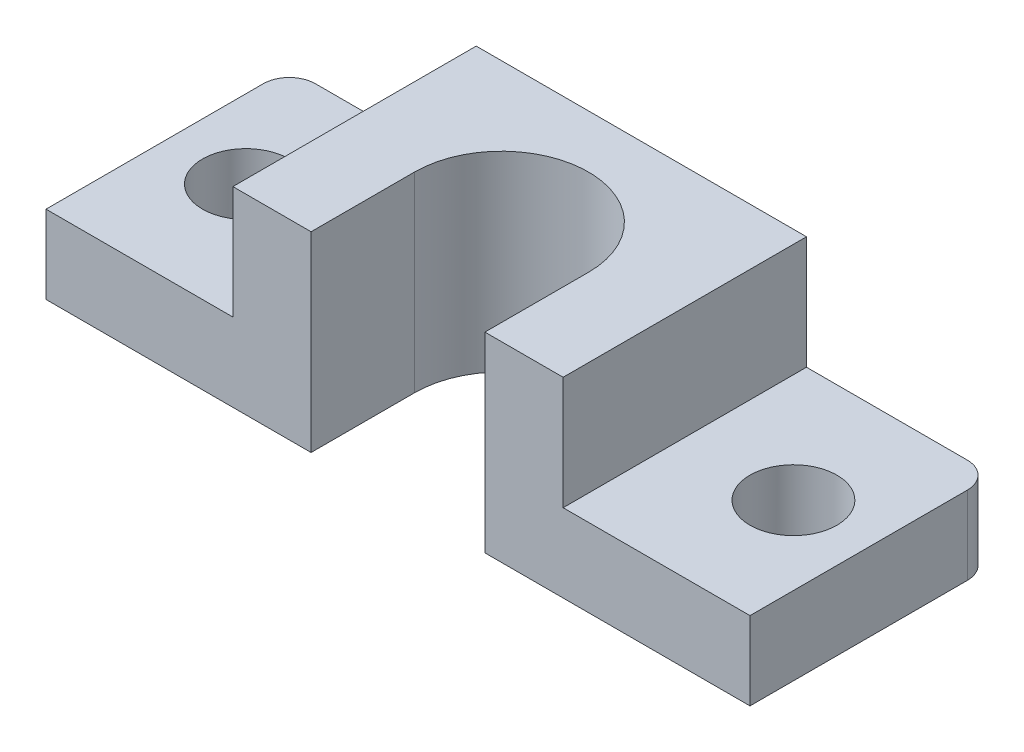
ISO-10303-21;
HEADER;
FILE_DESCRIPTION(('STEP AP214'),'2;1');
FILE_NAME('part.step','',(''),(''),'','','');
FILE_SCHEMA(('AUTOMOTIVE_DESIGN { 1 0 10303 214 1 1 1 1 }'));
ENDSEC;
DATA;
#1=APPLICATION_CONTEXT('core data for automotive mechanical design processes');
#2=APPLICATION_PROTOCOL_DEFINITION('international standard','automotive_design',2000,#1);
#3=PRODUCT_CONTEXT('',#1,'mechanical');
#4=PRODUCT('Part','Part','',(#3));
#5=PRODUCT_RELATED_PRODUCT_CATEGORY('part','',(#4));
#6=PRODUCT_DEFINITION_FORMATION('','',#4);
#7=PRODUCT_DEFINITION_CONTEXT('part definition',#1,'design');
#8=PRODUCT_DEFINITION('design','',#6,#7);
#9=PRODUCT_DEFINITION_SHAPE('','',#8);
#10=(LENGTH_UNIT() NAMED_UNIT(*) SI_UNIT(.MILLI.,.METRE.));
#11=(NAMED_UNIT(*) PLANE_ANGLE_UNIT() SI_UNIT($,.RADIAN.));
#12=(NAMED_UNIT(*) SI_UNIT($,.STERADIAN.) SOLID_ANGLE_UNIT());
#13=UNCERTAINTY_MEASURE_WITH_UNIT(LENGTH_MEASURE(1.E-05),#10,'distance_accuracy_value','');
#14=(GEOMETRIC_REPRESENTATION_CONTEXT(3) GLOBAL_UNCERTAINTY_ASSIGNED_CONTEXT((#13)) GLOBAL_UNIT_ASSIGNED_CONTEXT((#10,
#11,#12)) REPRESENTATION_CONTEXT('',''));
#15=CARTESIAN_POINT('',(0.,0.,0.));
#16=DIRECTION('',(0.,0.,1.));
#17=DIRECTION('',(1.,0.,0.));
#18=AXIS2_PLACEMENT_3D('',#15,#16,#17);
#19=CARTESIAN_POINT('',(0.,9.,0.));
#20=DIRECTION('',(0.,0.,-1.));
#21=DIRECTION('',(-1.,0.,0.));
#22=AXIS2_PLACEMENT_3D('',#19,#20,#21);
#23=PLANE('',#22);
#24=DIRECTION('',(1.,0.,0.));
#25=VECTOR('',#24,1.);
#26=CARTESIAN_POINT('',(0.,0.,0.));
#27=LINE('',#26,#25);
#28=CARTESIAN_POINT('',(0.,0.,0.));
#29=VERTEX_POINT('',#28);
#30=CARTESIAN_POINT('',(30.5,0.,0.));
#31=VERTEX_POINT('',#30);
#32=EDGE_CURVE('E217',#29,#31,#27,.T.);
#33=ORIENTED_EDGE('',*,*,#32,.T.);
#34=DIRECTION('',(0.,1.,0.));
#35=VECTOR('',#34,1.);
#36=CARTESIAN_POINT('',(30.5,-11.,0.));
#37=LINE('',#36,#35);
#38=CARTESIAN_POINT('',(30.5,22.,0.));
#39=VERTEX_POINT('',#38);
#40=EDGE_CURVE('E164',#31,#39,#37,.T.);
#41=ORIENTED_EDGE('',*,*,#40,.T.);
#42=DIRECTION('',(1.,0.,0.));
#43=VECTOR('',#42,1.);
#44=CARTESIAN_POINT('',(21.5,22.,0.));
#45=LINE('',#44,#43);
#46=CARTESIAN_POINT('',(21.5,22.,0.));
#47=VERTEX_POINT('',#46);
#48=EDGE_CURVE('E180',#47,#39,#45,.T.);
#49=ORIENTED_EDGE('',*,*,#48,.F.);
#50=DIRECTION('',(0.,-1.,0.));
#51=VECTOR('',#50,1.);
#52=CARTESIAN_POINT('',(21.5,22.,0.));
#53=LINE('',#52,#51);
#54=CARTESIAN_POINT('',(21.5,9.,0.));
#55=VERTEX_POINT('',#54);
#56=EDGE_CURVE('E199',#47,#55,#53,.T.);
#57=ORIENTED_EDGE('',*,*,#56,.T.);
#58=DIRECTION('',(1.,0.,0.));
#59=VECTOR('',#58,1.);
#60=CARTESIAN_POINT('',(0.,9.,0.));
#61=LINE('',#60,#59);
#62=CARTESIAN_POINT('',(0.,9.,0.));
#63=VERTEX_POINT('',#62);
#64=EDGE_CURVE('E207',#63,#55,#61,.T.);
#65=ORIENTED_EDGE('',*,*,#64,.F.);
#66=DIRECTION('',(0.,-1.,0.));
#67=VECTOR('',#66,1.);
#68=CARTESIAN_POINT('',(0.,9.,0.));
#69=LINE('',#68,#67);
#70=EDGE_CURVE('E226',#63,#29,#69,.T.);
#71=ORIENTED_EDGE('',*,*,#70,.T.);
#72=EDGE_LOOP('',(#33,#41,#49,#57,#65,#71));
#73=FACE_BOUND('',#72,.T.);
#74=ADVANCED_FACE('F33',(#73),#23,.F.);
#75=CARTESIAN_POINT('',(0.,9.,0.));
#76=DIRECTION('',(0.,-1.,0.));
#77=DIRECTION('',(0.,0.,-1.));
#78=AXIS2_PLACEMENT_3D('',#75,#76,#77);
#79=PLANE('',#78);
#80=CARTESIAN_POINT('',(9.,9.,-14.));
#81=DIRECTION('',(0.,1.,0.));
#82=DIRECTION('',(0.,0.,1.));
#83=AXIS2_PLACEMENT_3D('',#80,#81,#82);
#84=CIRCLE('',#83,5.);
#85=CARTESIAN_POINT('',(9.,9.,-9.));
#86=VERTEX_POINT('',#85);
#87=EDGE_CURVE('E232',#86,#86,#84,.T.);
#88=ORIENTED_EDGE('',*,*,#87,.F.);
#89=EDGE_LOOP('',(#88));
#90=FACE_BOUND('',#89,.T.);
#91=DIRECTION('',(-1.,0.,0.));
#92=VECTOR('',#91,1.);
#93=CARTESIAN_POINT('',(0.,9.,-28.));
#94=LINE('',#93,#92);
#95=CARTESIAN_POINT('',(21.5,9.,-28.));
#96=VERTEX_POINT('',#95);
#97=CARTESIAN_POINT('',(3.,9.,-28.));
#98=VERTEX_POINT('',#97);
#99=EDGE_CURVE('E211',#96,#98,#94,.T.);
#100=ORIENTED_EDGE('',*,*,#99,.T.);
#101=CARTESIAN_POINT('',(3.,9.,-25.));
#102=DIRECTION('',(0.,-1.,0.));
#103=DIRECTION('',(0.,0.,-1.));
#104=AXIS2_PLACEMENT_3D('',#101,#102,#103);
#105=CIRCLE('',#104,3.);
#106=CARTESIAN_POINT('',(0.,9.,-25.));
#107=VERTEX_POINT('',#106);
#108=EDGE_CURVE('E11',#98,#107,#105,.F.);
#109=ORIENTED_EDGE('',*,*,#108,.T.);
#110=DIRECTION('',(0.,0.,1.));
#111=VECTOR('',#110,1.);
#112=CARTESIAN_POINT('',(0.,9.,0.));
#113=LINE('',#112,#111);
#114=EDGE_CURVE('E203',#107,#63,#113,.T.);
#115=ORIENTED_EDGE('',*,*,#114,.T.);
#116=ORIENTED_EDGE('',*,*,#64,.T.);
#117=DIRECTION('',(0.,0.,1.));
#118=VECTOR('',#117,1.);
#119=CARTESIAN_POINT('',(21.5,9.,-28.));
#120=LINE('',#119,#118);
#121=EDGE_CURVE('E174',#96,#55,#120,.T.);
#122=ORIENTED_EDGE('',*,*,#121,.F.);
#123=EDGE_LOOP('',(#100,#109,#115,#116,#122));
#124=FACE_BOUND('',#123,.T.);
#125=ADVANCED_FACE('F262',(#90,#124),#79,.F.);
#126=CARTESIAN_POINT('',(72.,9.,-14.));
#127=DIRECTION('',(0.,1.,0.));
#128=DIRECTION('',(0.,0.,1.));
#129=AXIS2_PLACEMENT_3D('',#126,#127,#128);
#130=CIRCLE('',#129,5.);
#131=CARTESIAN_POINT('',(72.,9.,-9.));
#132=VERTEX_POINT('',#131);
#133=EDGE_CURVE('E236',#132,#132,#130,.T.);
#134=ORIENTED_EDGE('',*,*,#133,.F.);
#135=EDGE_LOOP('',(#134));
#136=FACE_BOUND('',#135,.T.);
#137=DIRECTION('',(0.,0.,-1.));
#138=VECTOR('',#137,1.);
#139=CARTESIAN_POINT('',(81.,9.,0.));
#140=LINE('',#139,#138);
#141=CARTESIAN_POINT('',(81.,9.,0.));
#142=VERTEX_POINT('',#141);
#143=CARTESIAN_POINT('',(81.,9.,-25.));
#144=VERTEX_POINT('',#143);
#145=EDGE_CURVE('E209',#142,#144,#140,.T.);
#146=ORIENTED_EDGE('',*,*,#145,.T.);
#147=CARTESIAN_POINT('',(78.,9.,-25.));
#148=DIRECTION('',(0.,-1.,0.));
#149=DIRECTION('',(0.,0.,-1.));
#150=AXIS2_PLACEMENT_3D('',#147,#148,#149);
#151=CIRCLE('',#150,3.);
#152=CARTESIAN_POINT('',(78.,9.,-28.));
#153=VERTEX_POINT('',#152);
#154=EDGE_CURVE('E246',#144,#153,#151,.F.);
#155=ORIENTED_EDGE('',*,*,#154,.T.);
#156=CARTESIAN_POINT('',(59.5,9.,-28.));
#157=VERTEX_POINT('',#156);
#158=EDGE_CURVE('E212',#153,#157,#94,.T.);
#159=ORIENTED_EDGE('',*,*,#158,.T.);
#160=DIRECTION('',(0.,0.,-1.));
#161=VECTOR('',#160,1.);
#162=CARTESIAN_POINT('',(59.5,9.,-28.));
#163=LINE('',#162,#161);
#164=CARTESIAN_POINT('',(59.5,9.,0.));
#165=VERTEX_POINT('',#164);
#166=EDGE_CURVE('E179',#165,#157,#163,.T.);
#167=ORIENTED_EDGE('',*,*,#166,.F.);
#168=EDGE_CURVE('E205',#165,#142,#61,.T.);
#169=ORIENTED_EDGE('',*,*,#168,.T.);
#170=EDGE_LOOP('',(#146,#155,#159,#167,#169));
#171=FACE_BOUND('',#170,.T.);
#172=ADVANCED_FACE('F281',(#136,#171),#79,.F.);
#173=CARTESIAN_POINT('',(0.,9.,0.));
#174=DIRECTION('',(1.,0.,0.));
#175=DIRECTION('',(0.,0.,-1.));
#176=AXIS2_PLACEMENT_3D('',#173,#174,#175);
#177=PLANE('',#176);
#178=ORIENTED_EDGE('',*,*,#114,.F.);
#179=DIRECTION('',(0.,-1.,0.));
#180=VECTOR('',#179,1.);
#181=CARTESIAN_POINT('',(0.,9.,-25.));
#182=LINE('',#181,#180);
#183=CARTESIAN_POINT('',(0.,0.,-25.));
#184=VERTEX_POINT('',#183);
#185=EDGE_CURVE('E41',#107,#184,#182,.T.);
#186=ORIENTED_EDGE('',*,*,#185,.T.);
#187=DIRECTION('',(0.,0.,1.));
#188=VECTOR('',#187,1.);
#189=CARTESIAN_POINT('',(0.,0.,0.));
#190=LINE('',#189,#188);
#191=EDGE_CURVE('E202',#184,#29,#190,.T.);
#192=ORIENTED_EDGE('',*,*,#191,.T.);
#193=ORIENTED_EDGE('',*,*,#70,.F.);
#194=EDGE_LOOP('',(#178,#186,#192,#193));
#195=FACE_BOUND('',#194,.T.);
#196=ADVANCED_FACE('F251',(#195),#177,.F.);
#197=CARTESIAN_POINT('',(50.5,22.,0.));
#198=VERTEX_POINT('',#197);
#199=CARTESIAN_POINT('',(59.5,22.,0.));
#200=VERTEX_POINT('',#199);
#201=EDGE_CURVE('E178',#198,#200,#45,.T.);
#202=ORIENTED_EDGE('',*,*,#201,.F.);
#203=DIRECTION('',(0.,1.,0.));
#204=VECTOR('',#203,1.);
#205=CARTESIAN_POINT('',(50.5,-11.,0.));
#206=LINE('',#205,#204);
#207=CARTESIAN_POINT('',(50.5,0.,0.));
#208=VERTEX_POINT('',#207);
#209=EDGE_CURVE('E147',#208,#198,#206,.T.);
#210=ORIENTED_EDGE('',*,*,#209,.F.);
#211=CARTESIAN_POINT('',(81.,0.,0.));
#212=VERTEX_POINT('',#211);
#213=EDGE_CURVE('E216',#208,#212,#27,.T.);
#214=ORIENTED_EDGE('',*,*,#213,.T.);
#215=DIRECTION('',(0.,-1.,0.));
#216=VECTOR('',#215,1.);
#217=CARTESIAN_POINT('',(81.,9.,0.));
#218=LINE('',#217,#216);
#219=EDGE_CURVE('E214',#142,#212,#218,.T.);
#220=ORIENTED_EDGE('',*,*,#219,.F.);
#221=ORIENTED_EDGE('',*,*,#168,.F.);
#222=DIRECTION('',(0.,-1.,0.));
#223=VECTOR('',#222,1.);
#224=CARTESIAN_POINT('',(59.5,22.,0.));
#225=LINE('',#224,#223);
#226=EDGE_CURVE('E196',#200,#165,#225,.T.);
#227=ORIENTED_EDGE('',*,*,#226,.F.);
#228=EDGE_LOOP('',(#202,#210,#214,#220,#221,#227));
#229=FACE_BOUND('',#228,.T.);
#230=ADVANCED_FACE('F284',(#229),#23,.F.);
#231=CARTESIAN_POINT('',(81.,9.,0.));
#232=DIRECTION('',(-1.,0.,0.));
#233=DIRECTION('',(0.,0.,1.));
#234=AXIS2_PLACEMENT_3D('',#231,#232,#233);
#235=PLANE('',#234);
#236=DIRECTION('',(0.,0.,-1.));
#237=VECTOR('',#236,1.);
#238=CARTESIAN_POINT('',(81.,0.,0.));
#239=LINE('',#238,#237);
#240=CARTESIAN_POINT('',(81.,0.,-25.));
#241=VERTEX_POINT('',#240);
#242=EDGE_CURVE('E220',#212,#241,#239,.T.);
#243=ORIENTED_EDGE('',*,*,#242,.T.);
#244=DIRECTION('',(0.,-1.,0.));
#245=VECTOR('',#244,1.);
#246=CARTESIAN_POINT('',(81.,9.,-25.));
#247=LINE('',#246,#245);
#248=EDGE_CURVE('E54',#241,#144,#247,.F.);
#249=ORIENTED_EDGE('',*,*,#248,.T.);
#250=ORIENTED_EDGE('',*,*,#145,.F.);
#251=ORIENTED_EDGE('',*,*,#219,.T.);
#252=EDGE_LOOP('',(#243,#249,#250,#251));
#253=FACE_BOUND('',#252,.T.);
#254=ADVANCED_FACE('F287',(#253),#235,.F.);
#255=CARTESIAN_POINT('',(0.,9.,-28.));
#256=DIRECTION('',(0.,0.,1.));
#257=DIRECTION('',(1.,0.,0.));
#258=AXIS2_PLACEMENT_3D('',#255,#256,#257);
#259=PLANE('',#258);
#260=ORIENTED_EDGE('',*,*,#158,.F.);
#261=DIRECTION('',(0.,-1.,0.));
#262=VECTOR('',#261,1.);
#263=CARTESIAN_POINT('',(78.,9.,-28.));
#264=LINE('',#263,#262);
#265=CARTESIAN_POINT('',(78.,0.,-28.));
#266=VERTEX_POINT('',#265);
#267=EDGE_CURVE('E238',#153,#266,#264,.T.);
#268=ORIENTED_EDGE('',*,*,#267,.T.);
#269=DIRECTION('',(-1.,0.,0.));
#270=VECTOR('',#269,1.);
#271=CARTESIAN_POINT('',(0.,0.,-28.));
#272=LINE('',#271,#270);
#273=CARTESIAN_POINT('',(3.,0.,-28.));
#274=VERTEX_POINT('',#273);
#275=EDGE_CURVE('E206',#266,#274,#272,.T.);
#276=ORIENTED_EDGE('',*,*,#275,.T.);
#277=DIRECTION('',(0.,-1.,0.));
#278=VECTOR('',#277,1.);
#279=CARTESIAN_POINT('',(3.,9.,-28.));
#280=LINE('',#279,#278);
#281=EDGE_CURVE('E229',#274,#98,#280,.F.);
#282=ORIENTED_EDGE('',*,*,#281,.T.);
#283=ORIENTED_EDGE('',*,*,#99,.F.);
#284=DIRECTION('',(0.,-1.,0.));
#285=VECTOR('',#284,1.);
#286=CARTESIAN_POINT('',(21.5,22.,-28.));
#287=LINE('',#286,#285);
#288=CARTESIAN_POINT('',(21.5,22.,-28.));
#289=VERTEX_POINT('',#288);
#290=EDGE_CURVE('E186',#289,#96,#287,.T.);
#291=ORIENTED_EDGE('',*,*,#290,.F.);
#292=DIRECTION('',(-1.,0.,0.));
#293=VECTOR('',#292,1.);
#294=CARTESIAN_POINT('',(21.5,22.,-28.));
#295=LINE('',#294,#293);
#296=CARTESIAN_POINT('',(59.5,22.,-28.));
#297=VERTEX_POINT('',#296);
#298=EDGE_CURVE('E184',#297,#289,#295,.T.);
#299=ORIENTED_EDGE('',*,*,#298,.F.);
#300=DIRECTION('',(0.,-1.,0.));
#301=VECTOR('',#300,1.);
#302=CARTESIAN_POINT('',(59.5,22.,-28.));
#303=LINE('',#302,#301);
#304=EDGE_CURVE('E193',#297,#157,#303,.T.);
#305=ORIENTED_EDGE('',*,*,#304,.T.);
#306=EDGE_LOOP('',(#260,#268,#276,#282,#283,#291,#299,#305));
#307=FACE_BOUND('',#306,.T.);
#308=ADVANCED_FACE('F268',(#307),#259,.F.);
#309=CARTESIAN_POINT('',(0.,0.,0.));
#310=DIRECTION('',(0.,-1.,0.));
#311=DIRECTION('',(0.,0.,-1.));
#312=AXIS2_PLACEMENT_3D('',#309,#310,#311);
#313=PLANE('',#312);
#314=CARTESIAN_POINT('',(72.,0.,-14.));
#315=DIRECTION('',(0.,-1.,0.));
#316=DIRECTION('',(0.,0.,-1.));
#317=AXIS2_PLACEMENT_3D('',#314,#315,#316);
#318=CIRCLE('',#317,5.);
#319=CARTESIAN_POINT('',(72.,0.,-19.));
#320=VERTEX_POINT('',#319);
#321=EDGE_CURVE('E233',#320,#320,#318,.T.);
#322=ORIENTED_EDGE('',*,*,#321,.F.);
#323=EDGE_LOOP('',(#322));
#324=FACE_BOUND('',#323,.T.);
#325=CARTESIAN_POINT('',(9.,0.,-14.));
#326=DIRECTION('',(0.,-1.,0.));
#327=DIRECTION('',(0.,0.,-1.));
#328=AXIS2_PLACEMENT_3D('',#325,#326,#327);
#329=CIRCLE('',#328,5.);
#330=CARTESIAN_POINT('',(9.,0.,-19.));
#331=VERTEX_POINT('',#330);
#332=EDGE_CURVE('E155',#331,#331,#329,.T.);
#333=ORIENTED_EDGE('',*,*,#332,.F.);
#334=EDGE_LOOP('',(#333));
#335=FACE_BOUND('',#334,.T.);
#336=ORIENTED_EDGE('',*,*,#275,.F.);
#337=CARTESIAN_POINT('',(78.,0.,-25.));
#338=DIRECTION('',(0.,-1.,0.));
#339=DIRECTION('',(0.,0.,-1.));
#340=AXIS2_PLACEMENT_3D('',#337,#338,#339);
#341=CIRCLE('',#340,3.);
#342=EDGE_CURVE('E243',#266,#241,#341,.T.);
#343=ORIENTED_EDGE('',*,*,#342,.T.);
#344=ORIENTED_EDGE('',*,*,#242,.F.);
#345=ORIENTED_EDGE('',*,*,#213,.F.);
#346=DIRECTION('',(0.,0.,1.));
#347=VECTOR('',#346,1.);
#348=CARTESIAN_POINT('',(50.5,0.,0.));
#349=LINE('',#348,#347);
#350=CARTESIAN_POINT('',(50.5,0.,-11.9148886894891));
#351=VERTEX_POINT('',#350);
#352=EDGE_CURVE('E167',#351,#208,#349,.T.);
#353=ORIENTED_EDGE('',*,*,#352,.F.);
#354=CARTESIAN_POINT('',(40.5,0.,-11.9148886894891));
#355=DIRECTION('',(0.,-1.,0.));
#356=DIRECTION('',(0.,0.,-1.));
#357=AXIS2_PLACEMENT_3D('',#354,#355,#356);
#358=CIRCLE('',#357,10.);
#359=CARTESIAN_POINT('',(30.5,0.,-11.9148886894891));
#360=VERTEX_POINT('',#359);
#361=EDGE_CURVE('E143',#360,#351,#358,.T.);
#362=ORIENTED_EDGE('',*,*,#361,.F.);
#363=DIRECTION('',(0.,0.,-1.));
#364=VECTOR('',#363,1.);
#365=CARTESIAN_POINT('',(30.5,0.,0.));
#366=LINE('',#365,#364);
#367=EDGE_CURVE('E172',#31,#360,#366,.T.);
#368=ORIENTED_EDGE('',*,*,#367,.F.);
#369=ORIENTED_EDGE('',*,*,#32,.F.);
#370=ORIENTED_EDGE('',*,*,#191,.F.);
#371=CARTESIAN_POINT('',(3.,0.,-25.));
#372=DIRECTION('',(0.,-1.,0.));
#373=DIRECTION('',(0.,0.,-1.));
#374=AXIS2_PLACEMENT_3D('',#371,#372,#373);
#375=CIRCLE('',#374,3.);
#376=EDGE_CURVE('E241',#184,#274,#375,.T.);
#377=ORIENTED_EDGE('',*,*,#376,.T.);
#378=EDGE_LOOP('',(#336,#343,#344,#345,#353,#362,#368,#369,#370,#377));
#379=FACE_BOUND('',#378,.T.);
#380=ADVANCED_FACE('F257',(#324,#335,#379),#313,.T.);
#381=CARTESIAN_POINT('',(21.5,22.,-28.));
#382=DIRECTION('',(1.,0.,0.));
#383=DIRECTION('',(0.,0.,-1.));
#384=AXIS2_PLACEMENT_3D('',#381,#382,#383);
#385=PLANE('',#384);
#386=ORIENTED_EDGE('',*,*,#121,.T.);
#387=ORIENTED_EDGE('',*,*,#56,.F.);
#388=DIRECTION('',(0.,0.,1.));
#389=VECTOR('',#388,1.);
#390=CARTESIAN_POINT('',(21.5,22.,-28.));
#391=LINE('',#390,#389);
#392=EDGE_CURVE('E175',#289,#47,#391,.T.);
#393=ORIENTED_EDGE('',*,*,#392,.F.);
#394=ORIENTED_EDGE('',*,*,#290,.T.);
#395=EDGE_LOOP('',(#386,#387,#393,#394));
#396=FACE_BOUND('',#395,.T.);
#397=ADVANCED_FACE('F272',(#396),#385,.F.);
#398=CARTESIAN_POINT('',(59.5,22.,-28.));
#399=DIRECTION('',(-1.,0.,0.));
#400=DIRECTION('',(0.,0.,1.));
#401=AXIS2_PLACEMENT_3D('',#398,#399,#400);
#402=PLANE('',#401);
#403=ORIENTED_EDGE('',*,*,#166,.T.);
#404=ORIENTED_EDGE('',*,*,#304,.F.);
#405=DIRECTION('',(0.,0.,-1.));
#406=VECTOR('',#405,1.);
#407=CARTESIAN_POINT('',(59.5,22.,-28.));
#408=LINE('',#407,#406);
#409=EDGE_CURVE('E182',#200,#297,#408,.T.);
#410=ORIENTED_EDGE('',*,*,#409,.F.);
#411=ORIENTED_EDGE('',*,*,#226,.T.);
#412=EDGE_LOOP('',(#403,#404,#410,#411));
#413=FACE_BOUND('',#412,.T.);
#414=ADVANCED_FACE('F277',(#413),#402,.F.);
#415=CARTESIAN_POINT('',(0.,22.,0.));
#416=DIRECTION('',(0.,1.,0.));
#417=DIRECTION('',(0.,0.,1.));
#418=AXIS2_PLACEMENT_3D('',#415,#416,#417);
#419=PLANE('',#418);
#420=DIRECTION('',(0.,0.,1.));
#421=VECTOR('',#420,1.);
#422=CARTESIAN_POINT('',(30.5,22.,0.));
#423=LINE('',#422,#421);
#424=CARTESIAN_POINT('',(30.5,22.,-11.9148886894891));
#425=VERTEX_POINT('',#424);
#426=EDGE_CURVE('E159',#425,#39,#423,.T.);
#427=ORIENTED_EDGE('',*,*,#426,.F.);
#428=CARTESIAN_POINT('',(40.5,22.,-11.9148886894891));
#429=DIRECTION('',(0.,1.,0.));
#430=DIRECTION('',(0.,0.,1.));
#431=AXIS2_PLACEMENT_3D('',#428,#429,#430);
#432=CIRCLE('',#431,10.);
#433=CARTESIAN_POINT('',(50.5,22.,-11.9148886894891));
#434=VERTEX_POINT('',#433);
#435=EDGE_CURVE('E140',#434,#425,#432,.T.);
#436=ORIENTED_EDGE('',*,*,#435,.F.);
#437=DIRECTION('',(0.,0.,-1.));
#438=VECTOR('',#437,1.);
#439=CARTESIAN_POINT('',(50.5,22.,-11.9148886894891));
#440=LINE('',#439,#438);
#441=EDGE_CURVE('E150',#198,#434,#440,.T.);
#442=ORIENTED_EDGE('',*,*,#441,.F.);
#443=ORIENTED_EDGE('',*,*,#201,.T.);
#444=ORIENTED_EDGE('',*,*,#409,.T.);
#445=ORIENTED_EDGE('',*,*,#298,.T.);
#446=ORIENTED_EDGE('',*,*,#392,.T.);
#447=ORIENTED_EDGE('',*,*,#48,.T.);
#448=EDGE_LOOP('',(#427,#436,#442,#443,#444,#445,#446,#447));
#449=FACE_BOUND('',#448,.T.);
#450=ADVANCED_FACE('F157',(#449),#419,.T.);
#451=CARTESIAN_POINT('',(30.5,-11.,0.));
#452=DIRECTION('',(-1.,0.,0.));
#453=DIRECTION('',(0.,0.,1.));
#454=AXIS2_PLACEMENT_3D('',#451,#452,#453);
#455=PLANE('',#454);
#456=ORIENTED_EDGE('',*,*,#367,.T.);
#457=DIRECTION('',(0.,1.,0.));
#458=VECTOR('',#457,1.);
#459=CARTESIAN_POINT('',(30.5,-11.,-11.9148886894891));
#460=LINE('',#459,#458);
#461=EDGE_CURVE('E146',#360,#425,#460,.T.);
#462=ORIENTED_EDGE('',*,*,#461,.T.);
#463=ORIENTED_EDGE('',*,*,#426,.T.);
#464=ORIENTED_EDGE('',*,*,#40,.F.);
#465=EDGE_LOOP('',(#456,#462,#463,#464));
#466=FACE_BOUND('',#465,.T.);
#467=ADVANCED_FACE('F349',(#466),#455,.F.);
#468=CARTESIAN_POINT('',(40.5,-11.,-11.9148886894891));
#469=DIRECTION('',(0.,1.,0.));
#470=DIRECTION('',(0.,0.,1.));
#471=AXIS2_PLACEMENT_3D('',#468,#469,#470);
#472=CYLINDRICAL_SURFACE('',#471,10.);
#473=ORIENTED_EDGE('',*,*,#361,.T.);
#474=DIRECTION('',(0.,1.,0.));
#475=VECTOR('',#474,1.);
#476=CARTESIAN_POINT('',(50.5,-11.,-11.9148886894891));
#477=LINE('',#476,#475);
#478=EDGE_CURVE('E135',#351,#434,#477,.T.);
#479=ORIENTED_EDGE('',*,*,#478,.T.);
#480=ORIENTED_EDGE('',*,*,#435,.T.);
#481=ORIENTED_EDGE('',*,*,#461,.F.);
#482=EDGE_LOOP('',(#473,#479,#480,#481));
#483=FACE_BOUND('',#482,.T.);
#484=ADVANCED_FACE('F137',(#483),#472,.F.);
#485=CARTESIAN_POINT('',(50.5,-11.,-11.9148886894891));
#486=DIRECTION('',(1.,0.,0.));
#487=DIRECTION('',(0.,0.,-1.));
#488=AXIS2_PLACEMENT_3D('',#485,#486,#487);
#489=PLANE('',#488);
#490=ORIENTED_EDGE('',*,*,#352,.T.);
#491=ORIENTED_EDGE('',*,*,#209,.T.);
#492=ORIENTED_EDGE('',*,*,#441,.T.);
#493=ORIENTED_EDGE('',*,*,#478,.F.);
#494=EDGE_LOOP('',(#490,#491,#492,#493));
#495=FACE_BOUND('',#494,.T.);
#496=ADVANCED_FACE('F151',(#495),#489,.F.);
#497=CARTESIAN_POINT('',(9.,-24.,-14.));
#498=DIRECTION('',(0.,1.,0.));
#499=DIRECTION('',(0.,0.,1.));
#500=AXIS2_PLACEMENT_3D('',#497,#498,#499);
#501=CYLINDRICAL_SURFACE('',#500,5.);
#502=ORIENTED_EDGE('',*,*,#332,.T.);
#503=EDGE_LOOP('',(#502));
#504=FACE_BOUND('',#503,.T.);
#505=ORIENTED_EDGE('',*,*,#87,.T.);
#506=EDGE_LOOP('',(#505));
#507=FACE_BOUND('',#506,.T.);
#508=ADVANCED_FACE('F369',(#504,#507),#501,.F.);
#509=CARTESIAN_POINT('',(72.,-24.,-14.));
#510=DIRECTION('',(0.,1.,0.));
#511=DIRECTION('',(0.,0.,1.));
#512=AXIS2_PLACEMENT_3D('',#509,#510,#511);
#513=CYLINDRICAL_SURFACE('',#512,5.);
#514=ORIENTED_EDGE('',*,*,#321,.T.);
#515=EDGE_LOOP('',(#514));
#516=FACE_BOUND('',#515,.T.);
#517=ORIENTED_EDGE('',*,*,#133,.T.);
#518=EDGE_LOOP('',(#517));
#519=FACE_BOUND('',#518,.T.);
#520=ADVANCED_FACE('F295',(#516,#519),#513,.F.);
#521=CARTESIAN_POINT('',(78.,9.,-25.));
#522=DIRECTION('',(0.,-1.,0.));
#523=DIRECTION('',(0.,0.,-1.));
#524=AXIS2_PLACEMENT_3D('',#521,#522,#523);
#525=CYLINDRICAL_SURFACE('',#524,3.);
#526=ORIENTED_EDGE('',*,*,#154,.F.);
#527=ORIENTED_EDGE('',*,*,#248,.F.);
#528=ORIENTED_EDGE('',*,*,#342,.F.);
#529=ORIENTED_EDGE('',*,*,#267,.F.);
#530=EDGE_LOOP('',(#526,#527,#528,#529));
#531=FACE_BOUND('',#530,.T.);
#532=ADVANCED_FACE('F290',(#531),#525,.T.);
#533=CARTESIAN_POINT('',(3.,9.,-25.));
#534=DIRECTION('',(0.,-1.,0.));
#535=DIRECTION('',(0.,0.,-1.));
#536=AXIS2_PLACEMENT_3D('',#533,#534,#535);
#537=CYLINDRICAL_SURFACE('',#536,3.);
#538=ORIENTED_EDGE('',*,*,#108,.F.);
#539=ORIENTED_EDGE('',*,*,#281,.F.);
#540=ORIENTED_EDGE('',*,*,#376,.F.);
#541=ORIENTED_EDGE('',*,*,#185,.F.);
#542=EDGE_LOOP('',(#538,#539,#540,#541));
#543=FACE_BOUND('',#542,.T.);
#544=ADVANCED_FACE('F35',(#543),#537,.T.);
#545=CLOSED_SHELL('',(#74,#125,#172,#196,#230,#254,#308,#380,#397,#414,#450,#467,#484,#496,#508,
#520,#532,#544));
#546=MANIFOLD_SOLID_BREP('B2',#545);
#547=ADVANCED_BREP_SHAPE_REPRESENTATION('',(#18,#546),#14);
#548=SHAPE_DEFINITION_REPRESENTATION(#9,#547);
ENDSEC;
END-ISO-10303-21;
